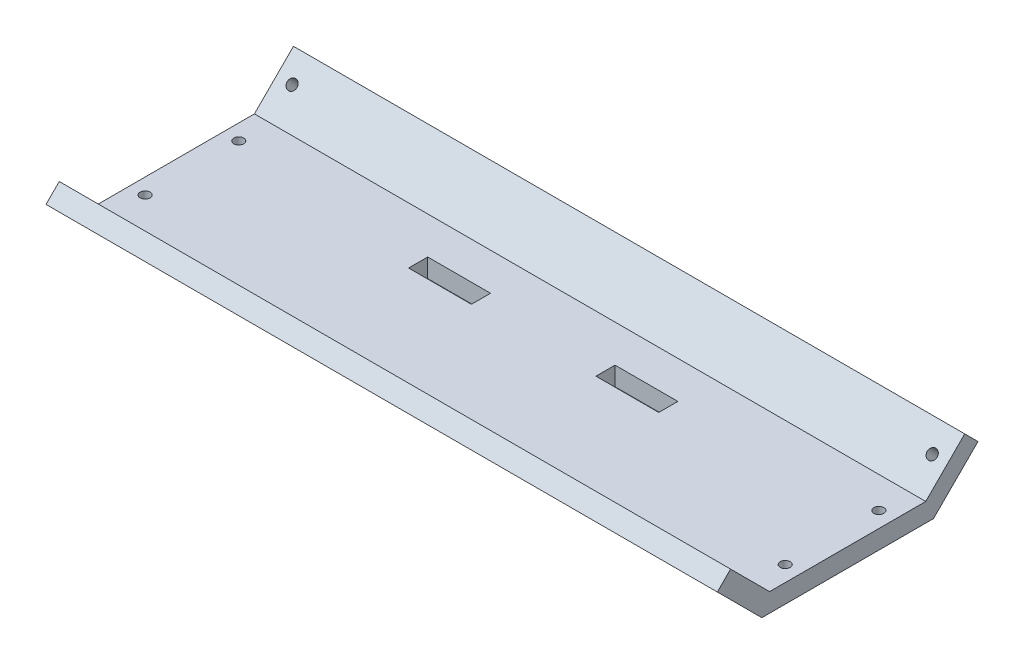
ISO-10303-21;
HEADER;
FILE_DESCRIPTION(('STEP AP214'),'2;1');
FILE_NAME('part.step','',(''),(''),'','','');
FILE_SCHEMA(('AUTOMOTIVE_DESIGN { 1 0 10303 214 1 1 1 1 }'));
ENDSEC;
DATA;
#1=APPLICATION_CONTEXT('core data for automotive mechanical design processes');
#2=APPLICATION_PROTOCOL_DEFINITION('international standard','automotive_design',2000,#1);
#3=PRODUCT_CONTEXT('',#1,'mechanical');
#4=PRODUCT('Part','Part','',(#3));
#5=PRODUCT_RELATED_PRODUCT_CATEGORY('part','',(#4));
#6=PRODUCT_DEFINITION_FORMATION('','',#4);
#7=PRODUCT_DEFINITION_CONTEXT('part definition',#1,'design');
#8=PRODUCT_DEFINITION('design','',#6,#7);
#9=PRODUCT_DEFINITION_SHAPE('','',#8);
#10=(LENGTH_UNIT() NAMED_UNIT(*) SI_UNIT(.MILLI.,.METRE.));
#11=(NAMED_UNIT(*) PLANE_ANGLE_UNIT() SI_UNIT($,.RADIAN.));
#12=(NAMED_UNIT(*) SI_UNIT($,.STERADIAN.) SOLID_ANGLE_UNIT());
#13=UNCERTAINTY_MEASURE_WITH_UNIT(LENGTH_MEASURE(1.E-05),#10,'distance_accuracy_value','');
#14=(GEOMETRIC_REPRESENTATION_CONTEXT(3) GLOBAL_UNCERTAINTY_ASSIGNED_CONTEXT((#13)) GLOBAL_UNIT_ASSIGNED_CONTEXT((#10,
#11,#12)) REPRESENTATION_CONTEXT('',''));
#15=CARTESIAN_POINT('',(0.,0.,0.));
#16=DIRECTION('',(0.,0.,1.));
#17=DIRECTION('',(1.,0.,0.));
#18=AXIS2_PLACEMENT_3D('',#15,#16,#17);
#19=CARTESIAN_POINT('',(107.5,12.4999999999999,37.5000000000001));
#20=DIRECTION('',(0.,-0.707106781186547,-0.707106781186548));
#21=DIRECTION('',(0.,0.707106781186548,-0.707106781186547));
#22=AXIS2_PLACEMENT_3D('',#19,#20,#21);
#23=PLANE('',#22);
#24=DIRECTION('',(0.,-0.707106781186548,0.707106781186547));
#25=VECTOR('',#24,1.);
#26=CARTESIAN_POINT('',(-107.5,12.4999999999999,37.5000000000001));
#27=LINE('',#26,#25);
#28=CARTESIAN_POINT('',(-107.5,12.4999999999999,37.5000000000001));
#29=VERTEX_POINT('',#28);
#30=CARTESIAN_POINT('',(-107.5,8.25735931288065,41.7426406871193));
#31=VERTEX_POINT('',#30);
#32=EDGE_CURVE('E269',#29,#31,#27,.T.);
#33=ORIENTED_EDGE('',*,*,#32,.T.);
#34=DIRECTION('',(-1.,0.,0.));
#35=VECTOR('',#34,1.);
#36=CARTESIAN_POINT('',(107.5,8.25735931288065,41.7426406871193));
#37=LINE('',#36,#35);
#38=CARTESIAN_POINT('',(107.5,8.25735931288065,41.7426406871193));
#39=VERTEX_POINT('',#38);
#40=EDGE_CURVE('E11',#39,#31,#37,.T.);
#41=ORIENTED_EDGE('',*,*,#40,.F.);
#42=DIRECTION('',(0.,-0.707106781186548,0.707106781186547));
#43=VECTOR('',#42,1.);
#44=CARTESIAN_POINT('',(107.5,12.4999999999999,37.5000000000001));
#45=LINE('',#44,#43);
#46=CARTESIAN_POINT('',(107.5,12.4999999999999,37.5000000000001));
#47=VERTEX_POINT('',#46);
#48=EDGE_CURVE('E270',#47,#39,#45,.T.);
#49=ORIENTED_EDGE('',*,*,#48,.F.);
#50=DIRECTION('',(-1.,0.,0.));
#51=VECTOR('',#50,1.);
#52=CARTESIAN_POINT('',(107.5,12.4999999999999,37.5000000000001));
#53=LINE('',#52,#51);
#54=EDGE_CURVE('E288',#47,#29,#53,.T.);
#55=ORIENTED_EDGE('',*,*,#54,.T.);
#56=EDGE_LOOP('',(#33,#41,#49,#55));
#57=FACE_BOUND('',#56,.T.);
#58=ADVANCED_FACE('F39',(#57),#23,.F.);
#59=CARTESIAN_POINT('',(107.5,-6.,27.4852813742388));
#60=DIRECTION('',(0.,0.707106781186545,-0.707106781186551));
#61=DIRECTION('',(0.,0.707106781186551,0.707106781186545));
#62=AXIS2_PLACEMENT_3D('',#59,#60,#61);
#63=PLANE('',#62);
#64=CARTESIAN_POINT('',(-102.5,2.8284271247461,36.3137084989848));
#65=DIRECTION('',(0.,0.707106781186545,-0.707106781186551));
#66=DIRECTION('',(0.,0.707106781186551,0.707106781186545));
#67=AXIS2_PLACEMENT_3D('',#64,#65,#66);
#68=CIRCLE('',#67,1.6);
#69=CARTESIAN_POINT('',(-102.5,3.95979797464458,37.4450793488833));
#70=VERTEX_POINT('',#69);
#71=EDGE_CURVE('E242',#70,#70,#68,.T.);
#72=ORIENTED_EDGE('',*,*,#71,.T.);
#73=EDGE_LOOP('',(#72));
#74=FACE_BOUND('',#73,.T.);
#75=CARTESIAN_POINT('',(102.5,2.8284271247461,36.3137084989848));
#76=DIRECTION('',(0.,0.707106781186545,-0.707106781186551));
#77=DIRECTION('',(0.,0.707106781186551,0.707106781186545));
#78=AXIS2_PLACEMENT_3D('',#75,#76,#77);
#79=CIRCLE('',#78,1.6);
#80=CARTESIAN_POINT('',(102.5,3.95979797464458,37.4450793488833));
#81=VERTEX_POINT('',#80);
#82=EDGE_CURVE('E248',#81,#81,#79,.T.);
#83=ORIENTED_EDGE('',*,*,#82,.T.);
#84=EDGE_LOOP('',(#83));
#85=FACE_BOUND('',#84,.T.);
#86=DIRECTION('',(0.,-0.707106781186551,-0.707106781186544));
#87=VECTOR('',#86,1.);
#88=CARTESIAN_POINT('',(-107.5,-6.,27.4852813742388));
#89=LINE('',#88,#87);
#90=CARTESIAN_POINT('',(-107.5,-6.,27.4852813742388));
#91=VERTEX_POINT('',#90);
#92=EDGE_CURVE('E291',#31,#91,#89,.T.);
#93=ORIENTED_EDGE('',*,*,#92,.T.);
#94=DIRECTION('',(-1.,0.,0.));
#95=VECTOR('',#94,1.);
#96=CARTESIAN_POINT('',(107.5,-6.,27.4852813742388));
#97=LINE('',#96,#95);
#98=CARTESIAN_POINT('',(107.5,-6.,27.4852813742388));
#99=VERTEX_POINT('',#98);
#100=EDGE_CURVE('E46',#99,#91,#97,.T.);
#101=ORIENTED_EDGE('',*,*,#100,.F.);
#102=DIRECTION('',(0.,-0.707106781186551,-0.707106781186544));
#103=VECTOR('',#102,1.);
#104=CARTESIAN_POINT('',(107.5,-6.,27.4852813742388));
#105=LINE('',#104,#103);
#106=EDGE_CURVE('E273',#39,#99,#105,.T.);
#107=ORIENTED_EDGE('',*,*,#106,.F.);
#108=ORIENTED_EDGE('',*,*,#40,.T.);
#109=EDGE_LOOP('',(#93,#101,#107,#108));
#110=FACE_BOUND('',#109,.T.);
#111=ADVANCED_FACE('F347',(#74,#85,#110),#63,.F.);
#112=CARTESIAN_POINT('',(107.5,-6.,27.4852813742388));
#113=DIRECTION('',(0.,1.,0.));
#114=DIRECTION('',(0.,0.,1.));
#115=AXIS2_PLACEMENT_3D('',#112,#113,#114);
#116=PLANE('',#115);
#117=DIRECTION('',(1.,0.,0.));
#118=VECTOR('',#117,1.);
#119=CARTESIAN_POINT('',(19.9375,-6.,-6.9375));
#120=LINE('',#119,#118);
#121=CARTESIAN_POINT('',(19.9375,-6.,-6.9375));
#122=VERTEX_POINT('',#121);
#123=CARTESIAN_POINT('',(40.0625,-6.,-6.9375));
#124=VERTEX_POINT('',#123);
#125=EDGE_CURVE('E163',#122,#124,#120,.T.);
#126=ORIENTED_EDGE('',*,*,#125,.T.);
#127=DIRECTION('',(0.,0.,-1.));
#128=VECTOR('',#127,1.);
#129=CARTESIAN_POINT('',(40.0625,-6.,-13.0625));
#130=LINE('',#129,#128);
#131=CARTESIAN_POINT('',(40.0625,-6.,-13.0625));
#132=VERTEX_POINT('',#131);
#133=EDGE_CURVE('E155',#124,#132,#130,.T.);
#134=ORIENTED_EDGE('',*,*,#133,.T.);
#135=DIRECTION('',(-1.,0.,0.));
#136=VECTOR('',#135,1.);
#137=CARTESIAN_POINT('',(19.9375,-6.,-13.0625));
#138=LINE('',#137,#136);
#139=CARTESIAN_POINT('',(19.9375,-6.,-13.0625));
#140=VERTEX_POINT('',#139);
#141=EDGE_CURVE('E166',#132,#140,#138,.T.);
#142=ORIENTED_EDGE('',*,*,#141,.T.);
#143=DIRECTION('',(0.,0.,1.));
#144=VECTOR('',#143,1.);
#145=CARTESIAN_POINT('',(19.9375,-6.,-13.0625));
#146=LINE('',#145,#144);
#147=EDGE_CURVE('E53',#140,#122,#146,.T.);
#148=ORIENTED_EDGE('',*,*,#147,.T.);
#149=EDGE_LOOP('',(#126,#134,#142,#148));
#150=FACE_BOUND('',#149,.T.);
#151=DIRECTION('',(1.,0.,0.));
#152=VECTOR('',#151,1.);
#153=CARTESIAN_POINT('',(-40.0625,-6.,-6.9375));
#154=LINE('',#153,#152);
#155=CARTESIAN_POINT('',(-40.0625,-6.,-6.9375));
#156=VERTEX_POINT('',#155);
#157=CARTESIAN_POINT('',(-19.9375,-6.,-6.9375));
#158=VERTEX_POINT('',#157);
#159=EDGE_CURVE('E196',#156,#158,#154,.T.);
#160=ORIENTED_EDGE('',*,*,#159,.T.);
#161=DIRECTION('',(0.,0.,-1.));
#162=VECTOR('',#161,1.);
#163=CARTESIAN_POINT('',(-19.9375,-6.,-13.0625));
#164=LINE('',#163,#162);
#165=CARTESIAN_POINT('',(-19.9375,-6.,-13.0625));
#166=VERTEX_POINT('',#165);
#167=EDGE_CURVE('E207',#158,#166,#164,.T.);
#168=ORIENTED_EDGE('',*,*,#167,.T.);
#169=DIRECTION('',(-1.,0.,0.));
#170=VECTOR('',#169,1.);
#171=CARTESIAN_POINT('',(-40.0625,-6.,-13.0625));
#172=LINE('',#171,#170);
#173=CARTESIAN_POINT('',(-40.0625,-6.,-13.0625));
#174=VERTEX_POINT('',#173);
#175=EDGE_CURVE('E217',#166,#174,#172,.T.);
#176=ORIENTED_EDGE('',*,*,#175,.T.);
#177=DIRECTION('',(0.,0.,1.));
#178=VECTOR('',#177,1.);
#179=CARTESIAN_POINT('',(-40.0625,-6.,-13.0625));
#180=LINE('',#179,#178);
#181=EDGE_CURVE('E61',#174,#156,#180,.T.);
#182=ORIENTED_EDGE('',*,*,#181,.T.);
#183=EDGE_LOOP('',(#160,#168,#176,#182));
#184=FACE_BOUND('',#183,.T.);
#185=CARTESIAN_POINT('',(-102.5,-6.,-15.0000000000001));
#186=DIRECTION('',(0.,1.,0.));
#187=DIRECTION('',(0.,0.,1.));
#188=AXIS2_PLACEMENT_3D('',#185,#186,#187);
#189=CIRCLE('',#188,1.6);
#190=CARTESIAN_POINT('',(-102.5,-6.,-13.4000000000001));
#191=VERTEX_POINT('',#190);
#192=EDGE_CURVE('E230',#191,#191,#189,.T.);
#193=ORIENTED_EDGE('',*,*,#192,.T.);
#194=EDGE_LOOP('',(#193));
#195=FACE_BOUND('',#194,.T.);
#196=CARTESIAN_POINT('',(-102.5,-6.,15.0000000000001));
#197=DIRECTION('',(0.,1.,0.));
#198=DIRECTION('',(0.,0.,1.));
#199=AXIS2_PLACEMENT_3D('',#196,#197,#198);
#200=CIRCLE('',#199,1.6);
#201=CARTESIAN_POINT('',(-102.5,-6.,16.6000000000001));
#202=VERTEX_POINT('',#201);
#203=EDGE_CURVE('E236',#202,#202,#200,.T.);
#204=ORIENTED_EDGE('',*,*,#203,.T.);
#205=EDGE_LOOP('',(#204));
#206=FACE_BOUND('',#205,.T.);
#207=CARTESIAN_POINT('',(102.5,-6.,15.0000000000001));
#208=DIRECTION('',(0.,1.,0.));
#209=DIRECTION('',(0.,0.,1.));
#210=AXIS2_PLACEMENT_3D('',#207,#208,#209);
#211=CIRCLE('',#210,1.6);
#212=CARTESIAN_POINT('',(102.5,-6.,16.6000000000001));
#213=VERTEX_POINT('',#212);
#214=EDGE_CURVE('E254',#213,#213,#211,.T.);
#215=ORIENTED_EDGE('',*,*,#214,.T.);
#216=EDGE_LOOP('',(#215));
#217=FACE_BOUND('',#216,.T.);
#218=CARTESIAN_POINT('',(102.5,-6.,-15.0000000000001));
#219=DIRECTION('',(0.,1.,0.));
#220=DIRECTION('',(0.,0.,1.));
#221=AXIS2_PLACEMENT_3D('',#218,#219,#220);
#222=CIRCLE('',#221,1.6);
#223=CARTESIAN_POINT('',(102.5,-6.,-13.4000000000001));
#224=VERTEX_POINT('',#223);
#225=EDGE_CURVE('E260',#224,#224,#222,.T.);
#226=ORIENTED_EDGE('',*,*,#225,.T.);
#227=EDGE_LOOP('',(#226));
#228=FACE_BOUND('',#227,.T.);
#229=DIRECTION('',(0.,0.,-1.));
#230=VECTOR('',#229,1.);
#231=CARTESIAN_POINT('',(-107.5,-6.,27.4852813742388));
#232=LINE('',#231,#230);
#233=CARTESIAN_POINT('',(-107.5,-6.,-27.4852813742387));
#234=VERTEX_POINT('',#233);
#235=EDGE_CURVE('E293',#91,#234,#232,.T.);
#236=ORIENTED_EDGE('',*,*,#235,.T.);
#237=DIRECTION('',(-1.,0.,0.));
#238=VECTOR('',#237,1.);
#239=CARTESIAN_POINT('',(107.5,-6.,-27.4852813742387));
#240=LINE('',#239,#238);
#241=CARTESIAN_POINT('',(107.5,-6.,-27.4852813742387));
#242=VERTEX_POINT('',#241);
#243=EDGE_CURVE('E318',#242,#234,#240,.T.);
#244=ORIENTED_EDGE('',*,*,#243,.F.);
#245=DIRECTION('',(0.,0.,-1.));
#246=VECTOR('',#245,1.);
#247=CARTESIAN_POINT('',(107.5,-6.,27.4852813742388));
#248=LINE('',#247,#246);
#249=EDGE_CURVE('E276',#99,#242,#248,.T.);
#250=ORIENTED_EDGE('',*,*,#249,.F.);
#251=ORIENTED_EDGE('',*,*,#100,.T.);
#252=EDGE_LOOP('',(#236,#244,#250,#251));
#253=FACE_BOUND('',#252,.T.);
#254=ADVANCED_FACE('F170',(#150,#184,#195,#206,#217,#228,#253),#116,.F.);
#255=CARTESIAN_POINT('',(107.5,-6.,-27.4852813742387));
#256=DIRECTION('',(0.,0.707106781186547,0.707106781186548));
#257=DIRECTION('',(0.,-0.707106781186548,0.707106781186547));
#258=AXIS2_PLACEMENT_3D('',#255,#256,#257);
#259=PLANE('',#258);
#260=CARTESIAN_POINT('',(-102.5,2.82842712474617,-36.3137084989848));
#261=DIRECTION('',(0.,0.707106781186547,0.707106781186548));
#262=DIRECTION('',(0.,-0.707106781186548,0.707106781186547));
#263=AXIS2_PLACEMENT_3D('',#260,#261,#262);
#264=CIRCLE('',#263,1.6);
#265=CARTESIAN_POINT('',(-102.5,1.69705627484769,-35.1823376490863));
#266=VERTEX_POINT('',#265);
#267=EDGE_CURVE('E224',#266,#266,#264,.T.);
#268=ORIENTED_EDGE('',*,*,#267,.T.);
#269=EDGE_LOOP('',(#268));
#270=FACE_BOUND('',#269,.T.);
#271=CARTESIAN_POINT('',(102.5,2.82842712474615,-36.3137084989848));
#272=DIRECTION('',(0.,0.707106781186547,0.707106781186548));
#273=DIRECTION('',(0.,-0.707106781186548,0.707106781186547));
#274=AXIS2_PLACEMENT_3D('',#271,#272,#273);
#275=CIRCLE('',#274,1.6);
#276=CARTESIAN_POINT('',(102.5,1.69705627484767,-35.1823376490863));
#277=VERTEX_POINT('',#276);
#278=EDGE_CURVE('E266',#277,#277,#275,.T.);
#279=ORIENTED_EDGE('',*,*,#278,.T.);
#280=EDGE_LOOP('',(#279));
#281=FACE_BOUND('',#280,.T.);
#282=DIRECTION('',(0.,0.707106781186548,-0.707106781186547));
#283=VECTOR('',#282,1.);
#284=CARTESIAN_POINT('',(-107.5,-6.,-27.4852813742387));
#285=LINE('',#284,#283);
#286=CARTESIAN_POINT('',(-107.5,8.25735931288065,-41.7426406871193));
#287=VERTEX_POINT('',#286);
#288=EDGE_CURVE('E295',#234,#287,#285,.T.);
#289=ORIENTED_EDGE('',*,*,#288,.T.);
#290=DIRECTION('',(-1.,0.,0.));
#291=VECTOR('',#290,1.);
#292=CARTESIAN_POINT('',(107.5,8.25735931288065,-41.7426406871193));
#293=LINE('',#292,#291);
#294=CARTESIAN_POINT('',(107.5,8.25735931288065,-41.7426406871193));
#295=VERTEX_POINT('',#294);
#296=EDGE_CURVE('E315',#295,#287,#293,.T.);
#297=ORIENTED_EDGE('',*,*,#296,.F.);
#298=DIRECTION('',(0.,0.707106781186548,-0.707106781186547));
#299=VECTOR('',#298,1.);
#300=CARTESIAN_POINT('',(107.5,-6.,-27.4852813742387));
#301=LINE('',#300,#299);
#302=EDGE_CURVE('E278',#242,#295,#301,.T.);
#303=ORIENTED_EDGE('',*,*,#302,.F.);
#304=ORIENTED_EDGE('',*,*,#243,.T.);
#305=EDGE_LOOP('',(#289,#297,#303,#304));
#306=FACE_BOUND('',#305,.T.);
#307=ADVANCED_FACE('F335',(#270,#281,#306),#259,.F.);
#308=CARTESIAN_POINT('',(107.5,12.5,-37.5));
#309=DIRECTION('',(0.,-0.707106781186547,0.707106781186548));
#310=DIRECTION('',(0.,-0.707106781186548,-0.707106781186547));
#311=AXIS2_PLACEMENT_3D('',#308,#309,#310);
#312=PLANE('',#311);
#313=DIRECTION('',(0.,0.707106781186548,0.707106781186547));
#314=VECTOR('',#313,1.);
#315=CARTESIAN_POINT('',(-107.5,12.5,-37.5));
#316=LINE('',#315,#314);
#317=CARTESIAN_POINT('',(-107.5,12.5,-37.5));
#318=VERTEX_POINT('',#317);
#319=EDGE_CURVE('E297',#287,#318,#316,.T.);
#320=ORIENTED_EDGE('',*,*,#319,.T.);
#321=DIRECTION('',(-1.,0.,0.));
#322=VECTOR('',#321,1.);
#323=CARTESIAN_POINT('',(107.5,12.5,-37.5));
#324=LINE('',#323,#322);
#325=CARTESIAN_POINT('',(107.5,12.5,-37.5));
#326=VERTEX_POINT('',#325);
#327=EDGE_CURVE('E312',#326,#318,#324,.T.);
#328=ORIENTED_EDGE('',*,*,#327,.F.);
#329=DIRECTION('',(0.,0.707106781186548,0.707106781186547));
#330=VECTOR('',#329,1.);
#331=CARTESIAN_POINT('',(107.5,12.5,-37.5));
#332=LINE('',#331,#330);
#333=EDGE_CURVE('E280',#295,#326,#332,.T.);
#334=ORIENTED_EDGE('',*,*,#333,.F.);
#335=ORIENTED_EDGE('',*,*,#296,.T.);
#336=EDGE_LOOP('',(#320,#328,#334,#335));
#337=FACE_BOUND('',#336,.T.);
#338=ADVANCED_FACE('F339',(#337),#312,.F.);
#339=CARTESIAN_POINT('',(107.5,0.,-25.0000000000001));
#340=DIRECTION('',(0.,-0.707106781186546,-0.707106781186549));
#341=DIRECTION('',(0.,0.707106781186549,-0.707106781186546));
#342=AXIS2_PLACEMENT_3D('',#339,#340,#341);
#343=PLANE('',#342);
#344=CARTESIAN_POINT('',(-102.5,7.07106781186545,-32.0710678118655));
#345=DIRECTION('',(0.,0.707106781186546,0.707106781186549));
#346=DIRECTION('',(0.,-0.707106781186549,0.707106781186546));
#347=AXIS2_PLACEMENT_3D('',#344,#345,#346);
#348=CIRCLE('',#347,1.6);
#349=CARTESIAN_POINT('',(-102.5,5.93969696196697,-30.9396969619671));
#350=VERTEX_POINT('',#349);
#351=EDGE_CURVE('E189',#350,#350,#348,.T.);
#352=ORIENTED_EDGE('',*,*,#351,.F.);
#353=EDGE_LOOP('',(#352));
#354=FACE_BOUND('',#353,.T.);
#355=CARTESIAN_POINT('',(102.5,7.07106781186544,-32.0710678118655));
#356=DIRECTION('',(0.,0.707106781186546,0.707106781186549));
#357=DIRECTION('',(0.,-0.707106781186549,0.707106781186546));
#358=AXIS2_PLACEMENT_3D('',#355,#356,#357);
#359=CIRCLE('',#358,1.6);
#360=CARTESIAN_POINT('',(102.5,5.93969696196696,-30.939696961967));
#361=VERTEX_POINT('',#360);
#362=EDGE_CURVE('E263',#361,#361,#359,.T.);
#363=ORIENTED_EDGE('',*,*,#362,.F.);
#364=EDGE_LOOP('',(#363));
#365=FACE_BOUND('',#364,.T.);
#366=DIRECTION('',(0.,-0.707106781186549,0.707106781186546));
#367=VECTOR('',#366,1.);
#368=CARTESIAN_POINT('',(-107.5,0.,-25.0000000000001));
#369=LINE('',#368,#367);
#370=CARTESIAN_POINT('',(-107.5,0.,-25.0000000000001));
#371=VERTEX_POINT('',#370);
#372=EDGE_CURVE('E299',#318,#371,#369,.T.);
#373=ORIENTED_EDGE('',*,*,#372,.T.);
#374=DIRECTION('',(-1.,0.,0.));
#375=VECTOR('',#374,1.);
#376=CARTESIAN_POINT('',(107.5,0.,-25.0000000000001));
#377=LINE('',#376,#375);
#378=CARTESIAN_POINT('',(107.5,0.,-25.0000000000001));
#379=VERTEX_POINT('',#378);
#380=EDGE_CURVE('E309',#379,#371,#377,.T.);
#381=ORIENTED_EDGE('',*,*,#380,.F.);
#382=DIRECTION('',(0.,-0.707106781186549,0.707106781186546));
#383=VECTOR('',#382,1.);
#384=CARTESIAN_POINT('',(107.5,0.,-25.0000000000001));
#385=LINE('',#384,#383);
#386=EDGE_CURVE('E282',#326,#379,#385,.T.);
#387=ORIENTED_EDGE('',*,*,#386,.F.);
#388=ORIENTED_EDGE('',*,*,#327,.T.);
#389=EDGE_LOOP('',(#373,#381,#387,#388));
#390=FACE_BOUND('',#389,.T.);
#391=ADVANCED_FACE('F360',(#354,#365,#390),#343,.F.);
#392=CARTESIAN_POINT('',(107.5,0.,25.0000000000001));
#393=DIRECTION('',(0.,-1.,0.));
#394=DIRECTION('',(0.,0.,-1.));
#395=AXIS2_PLACEMENT_3D('',#392,#393,#394);
#396=PLANE('',#395);
#397=DIRECTION('',(-1.,0.,0.));
#398=VECTOR('',#397,1.);
#399=CARTESIAN_POINT('',(19.9375,0.,-13.0625));
#400=LINE('',#399,#398);
#401=CARTESIAN_POINT('',(40.0625,0.,-13.0625));
#402=VERTEX_POINT('',#401);
#403=CARTESIAN_POINT('',(19.9375,0.,-13.0625));
#404=VERTEX_POINT('',#403);
#405=EDGE_CURVE('E182',#402,#404,#400,.T.);
#406=ORIENTED_EDGE('',*,*,#405,.F.);
#407=DIRECTION('',(0.,0.,-1.));
#408=VECTOR('',#407,1.);
#409=CARTESIAN_POINT('',(40.0625,0.,-13.0625));
#410=LINE('',#409,#408);
#411=CARTESIAN_POINT('',(40.0625,0.,-6.9375));
#412=VERTEX_POINT('',#411);
#413=EDGE_CURVE('E158',#412,#402,#410,.T.);
#414=ORIENTED_EDGE('',*,*,#413,.F.);
#415=DIRECTION('',(1.,0.,0.));
#416=VECTOR('',#415,1.);
#417=CARTESIAN_POINT('',(19.9375,0.,-6.9375));
#418=LINE('',#417,#416);
#419=CARTESIAN_POINT('',(19.9375,0.,-6.9375));
#420=VERTEX_POINT('',#419);
#421=EDGE_CURVE('E173',#420,#412,#418,.T.);
#422=ORIENTED_EDGE('',*,*,#421,.F.);
#423=DIRECTION('',(0.,0.,1.));
#424=VECTOR('',#423,1.);
#425=CARTESIAN_POINT('',(19.9375,0.,-13.0625));
#426=LINE('',#425,#424);
#427=EDGE_CURVE('E176',#404,#420,#426,.T.);
#428=ORIENTED_EDGE('',*,*,#427,.F.);
#429=EDGE_LOOP('',(#406,#414,#422,#428));
#430=FACE_BOUND('',#429,.T.);
#431=DIRECTION('',(-1.,0.,0.));
#432=VECTOR('',#431,1.);
#433=CARTESIAN_POINT('',(-40.0625,0.,-13.0625));
#434=LINE('',#433,#432);
#435=CARTESIAN_POINT('',(-19.9375,0.,-13.0625));
#436=VERTEX_POINT('',#435);
#437=CARTESIAN_POINT('',(-40.0625,0.,-13.0625));
#438=VERTEX_POINT('',#437);
#439=EDGE_CURVE('E210',#436,#438,#434,.T.);
#440=ORIENTED_EDGE('',*,*,#439,.F.);
#441=DIRECTION('',(0.,0.,-1.));
#442=VECTOR('',#441,1.);
#443=CARTESIAN_POINT('',(-19.9375,0.,-13.0625));
#444=LINE('',#443,#442);
#445=CARTESIAN_POINT('',(-19.9375,0.,-6.9375));
#446=VERTEX_POINT('',#445);
#447=EDGE_CURVE('E183',#446,#436,#444,.T.);
#448=ORIENTED_EDGE('',*,*,#447,.F.);
#449=DIRECTION('',(1.,0.,0.));
#450=VECTOR('',#449,1.);
#451=CARTESIAN_POINT('',(-40.0625,0.,-6.9375));
#452=LINE('',#451,#450);
#453=CARTESIAN_POINT('',(-40.0625,0.,-6.9375));
#454=VERTEX_POINT('',#453);
#455=EDGE_CURVE('E203',#454,#446,#452,.T.);
#456=ORIENTED_EDGE('',*,*,#455,.F.);
#457=DIRECTION('',(0.,0.,1.));
#458=VECTOR('',#457,1.);
#459=CARTESIAN_POINT('',(-40.0625,0.,-13.0625));
#460=LINE('',#459,#458);
#461=EDGE_CURVE('E206',#438,#454,#460,.T.);
#462=ORIENTED_EDGE('',*,*,#461,.F.);
#463=EDGE_LOOP('',(#440,#448,#456,#462));
#464=FACE_BOUND('',#463,.T.);
#465=CARTESIAN_POINT('',(-102.5,0.,-15.0000000000001));
#466=DIRECTION('',(0.,1.,0.));
#467=DIRECTION('',(0.,0.,1.));
#468=AXIS2_PLACEMENT_3D('',#465,#466,#467);
#469=CIRCLE('',#468,1.6);
#470=CARTESIAN_POINT('',(-102.5,0.,-13.4000000000001));
#471=VERTEX_POINT('',#470);
#472=EDGE_CURVE('E227',#471,#471,#469,.T.);
#473=ORIENTED_EDGE('',*,*,#472,.F.);
#474=EDGE_LOOP('',(#473));
#475=FACE_BOUND('',#474,.T.);
#476=CARTESIAN_POINT('',(-102.5,0.,15.0000000000001));
#477=DIRECTION('',(0.,1.,0.));
#478=DIRECTION('',(0.,0.,1.));
#479=AXIS2_PLACEMENT_3D('',#476,#477,#478);
#480=CIRCLE('',#479,1.6);
#481=CARTESIAN_POINT('',(-102.5,0.,16.6000000000001));
#482=VERTEX_POINT('',#481);
#483=EDGE_CURVE('E233',#482,#482,#480,.T.);
#484=ORIENTED_EDGE('',*,*,#483,.F.);
#485=EDGE_LOOP('',(#484));
#486=FACE_BOUND('',#485,.T.);
#487=CARTESIAN_POINT('',(102.5,0.,15.0000000000001));
#488=DIRECTION('',(0.,1.,0.));
#489=DIRECTION('',(0.,0.,1.));
#490=AXIS2_PLACEMENT_3D('',#487,#488,#489);
#491=CIRCLE('',#490,1.6);
#492=CARTESIAN_POINT('',(102.5,0.,16.6000000000001));
#493=VERTEX_POINT('',#492);
#494=EDGE_CURVE('E251',#493,#493,#491,.T.);
#495=ORIENTED_EDGE('',*,*,#494,.F.);
#496=EDGE_LOOP('',(#495));
#497=FACE_BOUND('',#496,.T.);
#498=CARTESIAN_POINT('',(102.5,0.,-15.0000000000001));
#499=DIRECTION('',(0.,1.,0.));
#500=DIRECTION('',(0.,0.,1.));
#501=AXIS2_PLACEMENT_3D('',#498,#499,#500);
#502=CIRCLE('',#501,1.6);
#503=CARTESIAN_POINT('',(102.5,0.,-13.4000000000001));
#504=VERTEX_POINT('',#503);
#505=EDGE_CURVE('E257',#504,#504,#502,.T.);
#506=ORIENTED_EDGE('',*,*,#505,.F.);
#507=EDGE_LOOP('',(#506));
#508=FACE_BOUND('',#507,.T.);
#509=DIRECTION('',(0.,0.,1.));
#510=VECTOR('',#509,1.);
#511=CARTESIAN_POINT('',(-107.5,0.,25.0000000000001));
#512=LINE('',#511,#510);
#513=CARTESIAN_POINT('',(-107.5,0.,25.0000000000001));
#514=VERTEX_POINT('',#513);
#515=EDGE_CURVE('E301',#371,#514,#512,.T.);
#516=ORIENTED_EDGE('',*,*,#515,.T.);
#517=DIRECTION('',(-1.,0.,0.));
#518=VECTOR('',#517,1.);
#519=CARTESIAN_POINT('',(107.5,0.,25.0000000000001));
#520=LINE('',#519,#518);
#521=CARTESIAN_POINT('',(107.5,0.,25.0000000000001));
#522=VERTEX_POINT('',#521);
#523=EDGE_CURVE('E306',#522,#514,#520,.T.);
#524=ORIENTED_EDGE('',*,*,#523,.F.);
#525=DIRECTION('',(0.,0.,1.));
#526=VECTOR('',#525,1.);
#527=CARTESIAN_POINT('',(107.5,0.,25.0000000000001));
#528=LINE('',#527,#526);
#529=EDGE_CURVE('E284',#379,#522,#528,.T.);
#530=ORIENTED_EDGE('',*,*,#529,.F.);
#531=ORIENTED_EDGE('',*,*,#380,.T.);
#532=EDGE_LOOP('',(#516,#524,#530,#531));
#533=FACE_BOUND('',#532,.T.);
#534=ADVANCED_FACE('F358',(#430,#464,#475,#486,#497,#508,#533),#396,.F.);
#535=CARTESIAN_POINT('',(107.5,0.,25.0000000000001));
#536=DIRECTION('',(0.,-0.707106781186551,0.707106781186544));
#537=DIRECTION('',(0.,-0.707106781186544,-0.707106781186551));
#538=AXIS2_PLACEMENT_3D('',#535,#536,#537);
#539=PLANE('',#538);
#540=CARTESIAN_POINT('',(-102.5,7.0710678118654,32.0710678118655));
#541=DIRECTION('',(0.,0.707106781186551,-0.707106781186544));
#542=DIRECTION('',(0.,0.707106781186544,0.707106781186551));
#543=AXIS2_PLACEMENT_3D('',#540,#541,#542);
#544=CIRCLE('',#543,1.6);
#545=CARTESIAN_POINT('',(-102.5,8.20243866176388,33.202438661764));
#546=VERTEX_POINT('',#545);
#547=EDGE_CURVE('E239',#546,#546,#544,.T.);
#548=ORIENTED_EDGE('',*,*,#547,.F.);
#549=EDGE_LOOP('',(#548));
#550=FACE_BOUND('',#549,.T.);
#551=CARTESIAN_POINT('',(102.5,7.0710678118654,32.0710678118655));
#552=DIRECTION('',(0.,0.707106781186551,-0.707106781186544));
#553=DIRECTION('',(0.,0.707106781186544,0.707106781186551));
#554=AXIS2_PLACEMENT_3D('',#551,#552,#553);
#555=CIRCLE('',#554,1.6);
#556=CARTESIAN_POINT('',(102.5,8.20243866176388,33.202438661764));
#557=VERTEX_POINT('',#556);
#558=EDGE_CURVE('E245',#557,#557,#555,.T.);
#559=ORIENTED_EDGE('',*,*,#558,.F.);
#560=EDGE_LOOP('',(#559));
#561=FACE_BOUND('',#560,.T.);
#562=DIRECTION('',(0.,0.707106781186544,0.707106781186551));
#563=VECTOR('',#562,1.);
#564=CARTESIAN_POINT('',(-107.5,0.,25.0000000000001));
#565=LINE('',#564,#563);
#566=EDGE_CURVE('E274',#514,#29,#565,.T.);
#567=ORIENTED_EDGE('',*,*,#566,.T.);
#568=ORIENTED_EDGE('',*,*,#54,.F.);
#569=DIRECTION('',(0.,0.707106781186544,0.707106781186551));
#570=VECTOR('',#569,1.);
#571=CARTESIAN_POINT('',(107.5,0.,25.0000000000001));
#572=LINE('',#571,#570);
#573=EDGE_CURVE('E286',#522,#47,#572,.T.);
#574=ORIENTED_EDGE('',*,*,#573,.F.);
#575=ORIENTED_EDGE('',*,*,#523,.T.);
#576=EDGE_LOOP('',(#567,#568,#574,#575));
#577=FACE_BOUND('',#576,.T.);
#578=ADVANCED_FACE('F353',(#550,#561,#577),#539,.F.);
#579=CARTESIAN_POINT('',(107.5,0.,0.));
#580=DIRECTION('',(-1.,0.,0.));
#581=DIRECTION('',(0.,0.,1.));
#582=AXIS2_PLACEMENT_3D('',#579,#580,#581);
#583=PLANE('',#582);
#584=ORIENTED_EDGE('',*,*,#48,.T.);
#585=ORIENTED_EDGE('',*,*,#106,.T.);
#586=ORIENTED_EDGE('',*,*,#249,.T.);
#587=ORIENTED_EDGE('',*,*,#302,.T.);
#588=ORIENTED_EDGE('',*,*,#333,.T.);
#589=ORIENTED_EDGE('',*,*,#386,.T.);
#590=ORIENTED_EDGE('',*,*,#529,.T.);
#591=ORIENTED_EDGE('',*,*,#573,.T.);
#592=EDGE_LOOP('',(#584,#585,#586,#587,#588,#589,#590,#591));
#593=FACE_BOUND('',#592,.T.);
#594=ADVANCED_FACE('F343',(#593),#583,.F.);
#595=CARTESIAN_POINT('',(-107.5,0.,0.));
#596=DIRECTION('',(-1.,0.,0.));
#597=DIRECTION('',(0.,0.,1.));
#598=AXIS2_PLACEMENT_3D('',#595,#596,#597);
#599=PLANE('',#598);
#600=ORIENTED_EDGE('',*,*,#32,.F.);
#601=ORIENTED_EDGE('',*,*,#566,.F.);
#602=ORIENTED_EDGE('',*,*,#515,.F.);
#603=ORIENTED_EDGE('',*,*,#372,.F.);
#604=ORIENTED_EDGE('',*,*,#319,.F.);
#605=ORIENTED_EDGE('',*,*,#288,.F.);
#606=ORIENTED_EDGE('',*,*,#235,.F.);
#607=ORIENTED_EDGE('',*,*,#92,.F.);
#608=EDGE_LOOP('',(#600,#601,#602,#603,#604,#605,#606,#607));
#609=FACE_BOUND('',#608,.T.);
#610=ADVANCED_FACE('F330',(#609),#599,.T.);
#611=CARTESIAN_POINT('',(102.5,7.07106781186544,-32.0710678118655));
#612=DIRECTION('',(0.,0.707106781186546,0.707106781186549));
#613=DIRECTION('',(0.,-0.707106781186549,0.707106781186546));
#614=AXIS2_PLACEMENT_3D('',#611,#612,#613);
#615=CYLINDRICAL_SURFACE('',#614,1.6);
#616=ORIENTED_EDGE('',*,*,#362,.T.);
#617=EDGE_LOOP('',(#616));
#618=FACE_BOUND('',#617,.T.);
#619=ORIENTED_EDGE('',*,*,#278,.F.);
#620=EDGE_LOOP('',(#619));
#621=FACE_BOUND('',#620,.T.);
#622=ADVANCED_FACE('F394',(#618,#621),#615,.F.);
#623=CARTESIAN_POINT('',(102.5,0.,-15.0000000000001));
#624=DIRECTION('',(0.,1.,0.));
#625=DIRECTION('',(0.,0.,1.));
#626=AXIS2_PLACEMENT_3D('',#623,#624,#625);
#627=CYLINDRICAL_SURFACE('',#626,1.6);
#628=ORIENTED_EDGE('',*,*,#225,.F.);
#629=EDGE_LOOP('',(#628));
#630=FACE_BOUND('',#629,.T.);
#631=ORIENTED_EDGE('',*,*,#505,.T.);
#632=EDGE_LOOP('',(#631));
#633=FACE_BOUND('',#632,.T.);
#634=ADVANCED_FACE('F396',(#630,#633),#627,.F.);
#635=CARTESIAN_POINT('',(102.5,0.,15.0000000000001));
#636=DIRECTION('',(0.,1.,0.));
#637=DIRECTION('',(0.,0.,1.));
#638=AXIS2_PLACEMENT_3D('',#635,#636,#637);
#639=CYLINDRICAL_SURFACE('',#638,1.6);
#640=ORIENTED_EDGE('',*,*,#214,.F.);
#641=EDGE_LOOP('',(#640));
#642=FACE_BOUND('',#641,.T.);
#643=ORIENTED_EDGE('',*,*,#494,.T.);
#644=EDGE_LOOP('',(#643));
#645=FACE_BOUND('',#644,.T.);
#646=ADVANCED_FACE('F402',(#642,#645),#639,.F.);
#647=CARTESIAN_POINT('',(102.5,7.0710678118654,32.0710678118655));
#648=DIRECTION('',(0.,0.707106781186551,-0.707106781186544));
#649=DIRECTION('',(0.,0.707106781186544,0.707106781186551));
#650=AXIS2_PLACEMENT_3D('',#647,#648,#649);
#651=CYLINDRICAL_SURFACE('',#650,1.6);
#652=ORIENTED_EDGE('',*,*,#558,.T.);
#653=EDGE_LOOP('',(#652));
#654=FACE_BOUND('',#653,.T.);
#655=ORIENTED_EDGE('',*,*,#82,.F.);
#656=EDGE_LOOP('',(#655));
#657=FACE_BOUND('',#656,.T.);
#658=ADVANCED_FACE('F417',(#654,#657),#651,.F.);
#659=CARTESIAN_POINT('',(-102.5,7.0710678118654,32.0710678118655));
#660=DIRECTION('',(0.,0.707106781186551,-0.707106781186544));
#661=DIRECTION('',(0.,0.707106781186544,0.707106781186551));
#662=AXIS2_PLACEMENT_3D('',#659,#660,#661);
#663=CYLINDRICAL_SURFACE('',#662,1.6);
#664=ORIENTED_EDGE('',*,*,#547,.T.);
#665=EDGE_LOOP('',(#664));
#666=FACE_BOUND('',#665,.T.);
#667=ORIENTED_EDGE('',*,*,#71,.F.);
#668=EDGE_LOOP('',(#667));
#669=FACE_BOUND('',#668,.T.);
#670=ADVANCED_FACE('F420',(#666,#669),#663,.F.);
#671=CARTESIAN_POINT('',(-102.5,0.,15.0000000000001));
#672=DIRECTION('',(0.,1.,0.));
#673=DIRECTION('',(0.,0.,1.));
#674=AXIS2_PLACEMENT_3D('',#671,#672,#673);
#675=CYLINDRICAL_SURFACE('',#674,1.6);
#676=ORIENTED_EDGE('',*,*,#203,.F.);
#677=EDGE_LOOP('',(#676));
#678=FACE_BOUND('',#677,.T.);
#679=ORIENTED_EDGE('',*,*,#483,.T.);
#680=EDGE_LOOP('',(#679));
#681=FACE_BOUND('',#680,.T.);
#682=ADVANCED_FACE('F427',(#678,#681),#675,.F.);
#683=CARTESIAN_POINT('',(-102.5,0.,-15.0000000000001));
#684=DIRECTION('',(0.,1.,0.));
#685=DIRECTION('',(0.,0.,1.));
#686=AXIS2_PLACEMENT_3D('',#683,#684,#685);
#687=CYLINDRICAL_SURFACE('',#686,1.6);
#688=ORIENTED_EDGE('',*,*,#192,.F.);
#689=EDGE_LOOP('',(#688));
#690=FACE_BOUND('',#689,.T.);
#691=ORIENTED_EDGE('',*,*,#472,.T.);
#692=EDGE_LOOP('',(#691));
#693=FACE_BOUND('',#692,.T.);
#694=ADVANCED_FACE('F434',(#690,#693),#687,.F.);
#695=CARTESIAN_POINT('',(-102.5,7.07106781186545,-32.0710678118655));
#696=DIRECTION('',(0.,0.707106781186546,0.707106781186549));
#697=DIRECTION('',(0.,-0.707106781186549,0.707106781186546));
#698=AXIS2_PLACEMENT_3D('',#695,#696,#697);
#699=CYLINDRICAL_SURFACE('',#698,1.6);
#700=ORIENTED_EDGE('',*,*,#351,.T.);
#701=EDGE_LOOP('',(#700));
#702=FACE_BOUND('',#701,.T.);
#703=ORIENTED_EDGE('',*,*,#267,.F.);
#704=EDGE_LOOP('',(#703));
#705=FACE_BOUND('',#704,.T.);
#706=ADVANCED_FACE('F438',(#702,#705),#699,.F.);
#707=CARTESIAN_POINT('',(-19.9375,-6.,-13.0625));
#708=DIRECTION('',(1.,0.,0.));
#709=DIRECTION('',(0.,0.,-1.));
#710=AXIS2_PLACEMENT_3D('',#707,#708,#709);
#711=PLANE('',#710);
#712=ORIENTED_EDGE('',*,*,#447,.T.);
#713=DIRECTION('',(0.,1.,0.));
#714=VECTOR('',#713,1.);
#715=CARTESIAN_POINT('',(-19.9375,-6.,-13.0625));
#716=LINE('',#715,#714);
#717=EDGE_CURVE('E193',#166,#436,#716,.T.);
#718=ORIENTED_EDGE('',*,*,#717,.F.);
#719=ORIENTED_EDGE('',*,*,#167,.F.);
#720=DIRECTION('',(0.,1.,0.));
#721=VECTOR('',#720,1.);
#722=CARTESIAN_POINT('',(-19.9375,-6.,-6.9375));
#723=LINE('',#722,#721);
#724=EDGE_CURVE('E201',#158,#446,#723,.T.);
#725=ORIENTED_EDGE('',*,*,#724,.T.);
#726=EDGE_LOOP('',(#712,#718,#719,#725));
#727=FACE_BOUND('',#726,.T.);
#728=ADVANCED_FACE('F442',(#727),#711,.F.);
#729=CARTESIAN_POINT('',(-40.0625,-6.,-6.9375));
#730=DIRECTION('',(0.,0.,1.));
#731=DIRECTION('',(0.,-1.,0.));
#732=AXIS2_PLACEMENT_3D('',#729,#730,#731);
#733=PLANE('',#732);
#734=ORIENTED_EDGE('',*,*,#455,.T.);
#735=ORIENTED_EDGE('',*,*,#724,.F.);
#736=ORIENTED_EDGE('',*,*,#159,.F.);
#737=DIRECTION('',(0.,1.,0.));
#738=VECTOR('',#737,1.);
#739=CARTESIAN_POINT('',(-40.0625,-6.,-6.9375));
#740=LINE('',#739,#738);
#741=EDGE_CURVE('E199',#156,#454,#740,.T.);
#742=ORIENTED_EDGE('',*,*,#741,.T.);
#743=EDGE_LOOP('',(#734,#735,#736,#742));
#744=FACE_BOUND('',#743,.T.);
#745=ADVANCED_FACE('F444',(#744),#733,.F.);
#746=CARTESIAN_POINT('',(-40.0625,-6.,-13.0625));
#747=DIRECTION('',(-1.,0.,0.));
#748=DIRECTION('',(0.,0.,1.));
#749=AXIS2_PLACEMENT_3D('',#746,#747,#748);
#750=PLANE('',#749);
#751=ORIENTED_EDGE('',*,*,#461,.T.);
#752=ORIENTED_EDGE('',*,*,#741,.F.);
#753=ORIENTED_EDGE('',*,*,#181,.F.);
#754=DIRECTION('',(0.,1.,0.));
#755=VECTOR('',#754,1.);
#756=CARTESIAN_POINT('',(-40.0625,-6.,-13.0625));
#757=LINE('',#756,#755);
#758=EDGE_CURVE('E197',#174,#438,#757,.T.);
#759=ORIENTED_EDGE('',*,*,#758,.T.);
#760=EDGE_LOOP('',(#751,#752,#753,#759));
#761=FACE_BOUND('',#760,.T.);
#762=ADVANCED_FACE('F447',(#761),#750,.F.);
#763=CARTESIAN_POINT('',(-40.0625,-6.,-13.0625));
#764=DIRECTION('',(0.,0.,-1.));
#765=DIRECTION('',(-1.,0.,0.));
#766=AXIS2_PLACEMENT_3D('',#763,#764,#765);
#767=PLANE('',#766);
#768=ORIENTED_EDGE('',*,*,#439,.T.);
#769=ORIENTED_EDGE('',*,*,#758,.F.);
#770=ORIENTED_EDGE('',*,*,#175,.F.);
#771=ORIENTED_EDGE('',*,*,#717,.T.);
#772=EDGE_LOOP('',(#768,#769,#770,#771));
#773=FACE_BOUND('',#772,.T.);
#774=ADVANCED_FACE('F451',(#773),#767,.F.);
#775=CARTESIAN_POINT('',(40.0625,-6.,-13.0625));
#776=DIRECTION('',(1.,0.,0.));
#777=DIRECTION('',(0.,0.,-1.));
#778=AXIS2_PLACEMENT_3D('',#775,#776,#777);
#779=PLANE('',#778);
#780=ORIENTED_EDGE('',*,*,#413,.T.);
#781=DIRECTION('',(0.,1.,0.));
#782=VECTOR('',#781,1.);
#783=CARTESIAN_POINT('',(40.0625,-6.,-13.0625));
#784=LINE('',#783,#782);
#785=EDGE_CURVE('E151',#132,#402,#784,.T.);
#786=ORIENTED_EDGE('',*,*,#785,.F.);
#787=ORIENTED_EDGE('',*,*,#133,.F.);
#788=DIRECTION('',(0.,1.,0.));
#789=VECTOR('',#788,1.);
#790=CARTESIAN_POINT('',(40.0625,-6.,-6.9375));
#791=LINE('',#790,#789);
#792=EDGE_CURVE('E187',#124,#412,#791,.T.);
#793=ORIENTED_EDGE('',*,*,#792,.T.);
#794=EDGE_LOOP('',(#780,#786,#787,#793));
#795=FACE_BOUND('',#794,.T.);
#796=ADVANCED_FACE('F153',(#795),#779,.F.);
#797=CARTESIAN_POINT('',(19.9375,-6.,-6.9375));
#798=DIRECTION('',(0.,0.,1.));
#799=DIRECTION('',(0.,-1.,0.));
#800=AXIS2_PLACEMENT_3D('',#797,#798,#799);
#801=PLANE('',#800);
#802=ORIENTED_EDGE('',*,*,#421,.T.);
#803=ORIENTED_EDGE('',*,*,#792,.F.);
#804=ORIENTED_EDGE('',*,*,#125,.F.);
#805=DIRECTION('',(0.,1.,0.));
#806=VECTOR('',#805,1.);
#807=CARTESIAN_POINT('',(19.9375,-6.,-6.9375));
#808=LINE('',#807,#806);
#809=EDGE_CURVE('E190',#122,#420,#808,.T.);
#810=ORIENTED_EDGE('',*,*,#809,.T.);
#811=EDGE_LOOP('',(#802,#803,#804,#810));
#812=FACE_BOUND('',#811,.T.);
#813=ADVANCED_FACE('F460',(#812),#801,.F.);
#814=CARTESIAN_POINT('',(19.9375,-6.,-13.0625));
#815=DIRECTION('',(-1.,0.,0.));
#816=DIRECTION('',(0.,0.,1.));
#817=AXIS2_PLACEMENT_3D('',#814,#815,#816);
#818=PLANE('',#817);
#819=ORIENTED_EDGE('',*,*,#427,.T.);
#820=ORIENTED_EDGE('',*,*,#809,.F.);
#821=ORIENTED_EDGE('',*,*,#147,.F.);
#822=DIRECTION('',(0.,1.,0.));
#823=VECTOR('',#822,1.);
#824=CARTESIAN_POINT('',(19.9375,-6.,-13.0625));
#825=LINE('',#824,#823);
#826=EDGE_CURVE('E162',#140,#404,#825,.T.);
#827=ORIENTED_EDGE('',*,*,#826,.T.);
#828=EDGE_LOOP('',(#819,#820,#821,#827));
#829=FACE_BOUND('',#828,.T.);
#830=ADVANCED_FACE('F463',(#829),#818,.F.);
#831=CARTESIAN_POINT('',(19.9375,-6.,-13.0625));
#832=DIRECTION('',(0.,0.,-1.));
#833=DIRECTION('',(0.,1.,0.));
#834=AXIS2_PLACEMENT_3D('',#831,#832,#833);
#835=PLANE('',#834);
#836=ORIENTED_EDGE('',*,*,#405,.T.);
#837=ORIENTED_EDGE('',*,*,#826,.F.);
#838=ORIENTED_EDGE('',*,*,#141,.F.);
#839=ORIENTED_EDGE('',*,*,#785,.T.);
#840=EDGE_LOOP('',(#836,#837,#838,#839));
#841=FACE_BOUND('',#840,.T.);
#842=ADVANCED_FACE('F167',(#841),#835,.F.);
#843=CLOSED_SHELL('',(#58,#111,#254,#307,#338,#391,#534,#578,#594,#610,#622,#634,#646,#658,#670,
#682,#694,#706,#728,#745,#762,#774,#796,#813,#830,#842));
#844=MANIFOLD_SOLID_BREP('B2',#843);
#845=ADVANCED_BREP_SHAPE_REPRESENTATION('',(#18,#844),#14);
#846=SHAPE_DEFINITION_REPRESENTATION(#9,#845);
ENDSEC;
END-ISO-10303-21;
